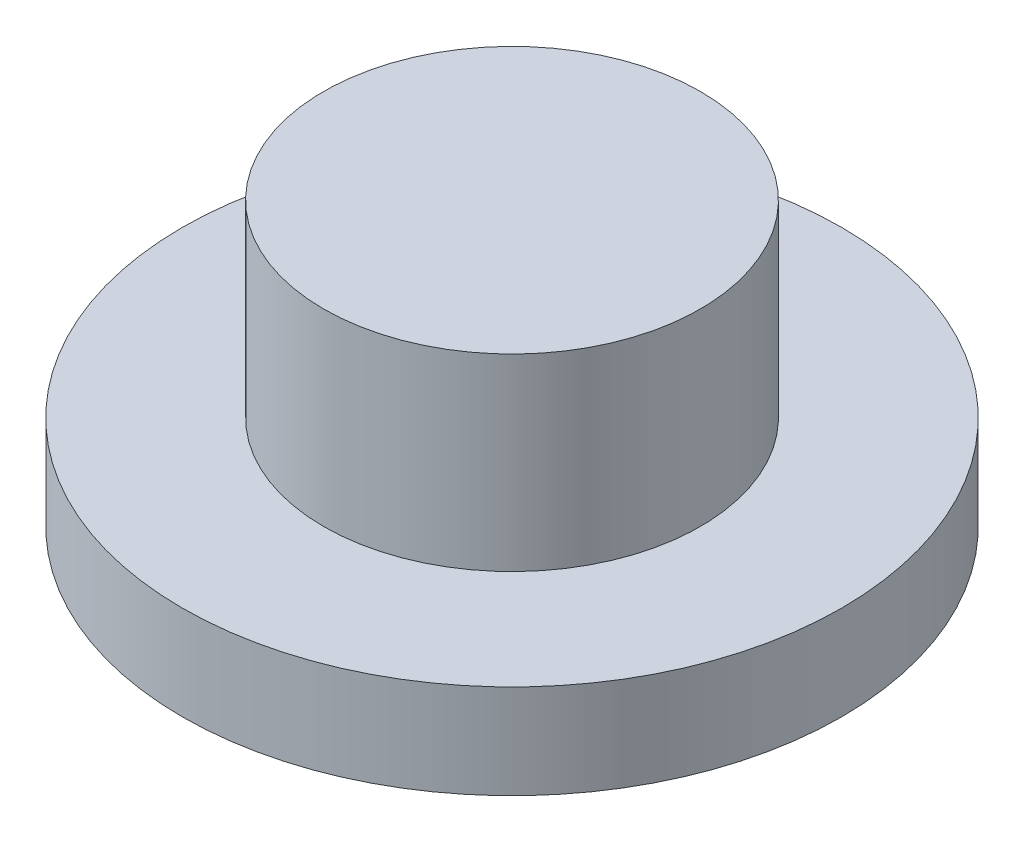
ISO-10303-21;
HEADER;
FILE_DESCRIPTION(('STEP AP214'),'2;1');
FILE_NAME('part.step','',(''),(''),'','','');
FILE_SCHEMA(('AUTOMOTIVE_DESIGN { 1 0 10303 214 1 1 1 1 }'));
ENDSEC;
DATA;
#1=APPLICATION_CONTEXT('core data for automotive mechanical design processes');
#2=APPLICATION_PROTOCOL_DEFINITION('international standard','automotive_design',2000,#1);
#3=PRODUCT_CONTEXT('',#1,'mechanical');
#4=PRODUCT('Part','Part','',(#3));
#5=PRODUCT_RELATED_PRODUCT_CATEGORY('part','',(#4));
#6=PRODUCT_DEFINITION_FORMATION('','',#4);
#7=PRODUCT_DEFINITION_CONTEXT('part definition',#1,'design');
#8=PRODUCT_DEFINITION('design','',#6,#7);
#9=PRODUCT_DEFINITION_SHAPE('','',#8);
#10=(LENGTH_UNIT() NAMED_UNIT(*) SI_UNIT(.MILLI.,.METRE.));
#11=(NAMED_UNIT(*) PLANE_ANGLE_UNIT() SI_UNIT($,.RADIAN.));
#12=(NAMED_UNIT(*) SI_UNIT($,.STERADIAN.) SOLID_ANGLE_UNIT());
#13=UNCERTAINTY_MEASURE_WITH_UNIT(LENGTH_MEASURE(1.E-05),#10,'distance_accuracy_value','');
#14=(GEOMETRIC_REPRESENTATION_CONTEXT(3) GLOBAL_UNCERTAINTY_ASSIGNED_CONTEXT((#13)) GLOBAL_UNIT_ASSIGNED_CONTEXT((#10,
#11,#12)) REPRESENTATION_CONTEXT('',''));
#15=CARTESIAN_POINT('',(0.,0.,0.));
#16=DIRECTION('',(0.,0.,1.));
#17=DIRECTION('',(1.,0.,0.));
#18=AXIS2_PLACEMENT_3D('',#15,#16,#17);
#19=CARTESIAN_POINT('',(0.,10.,0.));
#20=DIRECTION('',(0.,-1.,0.));
#21=DIRECTION('',(0.,0.,-1.));
#22=AXIS2_PLACEMENT_3D('',#19,#20,#21);
#23=CYLINDRICAL_SURFACE('',#22,35.);
#24=CARTESIAN_POINT('',(0.,10.,0.));
#25=DIRECTION('',(0.,1.,0.));
#26=DIRECTION('',(0.,0.,1.));
#27=AXIS2_PLACEMENT_3D('',#24,#25,#26);
#28=CIRCLE('',#27,35.);
#29=CARTESIAN_POINT('',(0.,10.,35.));
#30=VERTEX_POINT('',#29);
#31=EDGE_CURVE('E38',#30,#30,#28,.T.);
#32=ORIENTED_EDGE('',*,*,#31,.F.);
#33=EDGE_LOOP('',(#32));
#34=FACE_BOUND('',#33,.T.);
#35=CARTESIAN_POINT('',(0.,0.,0.));
#36=DIRECTION('',(0.,1.,0.));
#37=DIRECTION('',(0.,0.,1.));
#38=AXIS2_PLACEMENT_3D('',#35,#36,#37);
#39=CIRCLE('',#38,35.);
#40=CARTESIAN_POINT('',(0.,0.,35.));
#41=VERTEX_POINT('',#40);
#42=EDGE_CURVE('E34',#41,#41,#39,.T.);
#43=ORIENTED_EDGE('',*,*,#42,.T.);
#44=EDGE_LOOP('',(#43));
#45=FACE_BOUND('',#44,.T.);
#46=ADVANCED_FACE('F31',(#34,#45),#23,.T.);
#47=CARTESIAN_POINT('',(0.,10.,0.));
#48=DIRECTION('',(0.,1.,0.));
#49=DIRECTION('',(0.,0.,1.));
#50=AXIS2_PLACEMENT_3D('',#47,#48,#49);
#51=PLANE('',#50);
#52=CARTESIAN_POINT('',(0.,10.,0.));
#53=DIRECTION('',(0.,1.,0.));
#54=DIRECTION('',(0.,0.,1.));
#55=AXIS2_PLACEMENT_3D('',#52,#53,#54);
#56=CIRCLE('',#55,20.);
#57=CARTESIAN_POINT('',(0.,10.,20.));
#58=VERTEX_POINT('',#57);
#59=EDGE_CURVE('E10',#58,#58,#56,.T.);
#60=ORIENTED_EDGE('',*,*,#59,.F.);
#61=EDGE_LOOP('',(#60));
#62=FACE_BOUND('',#61,.T.);
#63=ORIENTED_EDGE('',*,*,#31,.T.);
#64=EDGE_LOOP('',(#63));
#65=FACE_BOUND('',#64,.T.);
#66=ADVANCED_FACE('F55',(#62,#65),#51,.T.);
#67=CARTESIAN_POINT('',(0.,0.,0.));
#68=DIRECTION('',(0.,1.,0.));
#69=DIRECTION('',(0.,0.,1.));
#70=AXIS2_PLACEMENT_3D('',#67,#68,#69);
#71=PLANE('',#70);
#72=ORIENTED_EDGE('',*,*,#42,.F.);
#73=EDGE_LOOP('',(#72));
#74=FACE_BOUND('',#73,.T.);
#75=ADVANCED_FACE('F52',(#74),#71,.F.);
#76=CARTESIAN_POINT('',(0.,30.,0.));
#77=DIRECTION('',(0.,-1.,0.));
#78=DIRECTION('',(0.,0.,-1.));
#79=AXIS2_PLACEMENT_3D('',#76,#77,#78);
#80=CYLINDRICAL_SURFACE('',#79,20.);
#81=CARTESIAN_POINT('',(0.,30.,0.));
#82=DIRECTION('',(0.,1.,0.));
#83=DIRECTION('',(0.,0.,1.));
#84=AXIS2_PLACEMENT_3D('',#81,#82,#83);
#85=CIRCLE('',#84,20.);
#86=CARTESIAN_POINT('',(0.,30.,20.));
#87=VERTEX_POINT('',#86);
#88=EDGE_CURVE('E44',#87,#87,#85,.T.);
#89=ORIENTED_EDGE('',*,*,#88,.F.);
#90=EDGE_LOOP('',(#89));
#91=FACE_BOUND('',#90,.T.);
#92=ORIENTED_EDGE('',*,*,#59,.T.);
#93=EDGE_LOOP('',(#92));
#94=FACE_BOUND('',#93,.T.);
#95=ADVANCED_FACE('F54',(#91,#94),#80,.T.);
#96=CARTESIAN_POINT('',(0.,30.,0.));
#97=DIRECTION('',(0.,1.,0.));
#98=DIRECTION('',(0.,0.,1.));
#99=AXIS2_PLACEMENT_3D('',#96,#97,#98);
#100=PLANE('',#99);
#101=ORIENTED_EDGE('',*,*,#88,.T.);
#102=EDGE_LOOP('',(#101));
#103=FACE_BOUND('',#102,.T.);
#104=ADVANCED_FACE('F60',(#103),#100,.T.);
#105=CLOSED_SHELL('',(#46,#66,#75,#95,#104));
#106=MANIFOLD_SOLID_BREP('B2',#105);
#107=ADVANCED_BREP_SHAPE_REPRESENTATION('',(#18,#106),#14);
#108=SHAPE_DEFINITION_REPRESENTATION(#9,#107);
ENDSEC;
END-ISO-10303-21;
